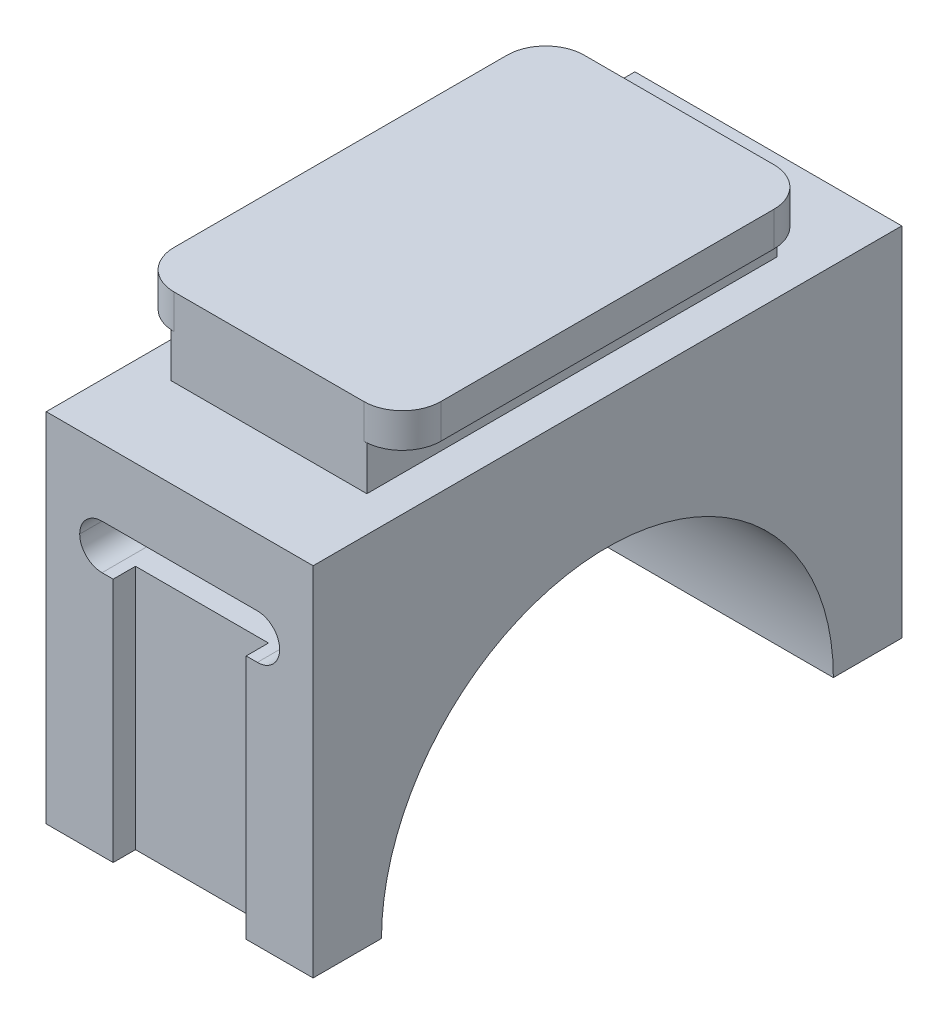
ISO-10303-21;
HEADER;
FILE_DESCRIPTION(('STEP AP214'),'2;1');
FILE_NAME('part.step','',(''),(''),'','','');
FILE_SCHEMA(('AUTOMOTIVE_DESIGN { 1 0 10303 214 1 1 1 1 }'));
ENDSEC;
DATA;
#1=APPLICATION_CONTEXT('core data for automotive mechanical design processes');
#2=APPLICATION_PROTOCOL_DEFINITION('international standard','automotive_design',2000,#1);
#3=PRODUCT_CONTEXT('',#1,'mechanical');
#4=PRODUCT('Part','Part','',(#3));
#5=PRODUCT_RELATED_PRODUCT_CATEGORY('part','',(#4));
#6=PRODUCT_DEFINITION_FORMATION('','',#4);
#7=PRODUCT_DEFINITION_CONTEXT('part definition',#1,'design');
#8=PRODUCT_DEFINITION('design','',#6,#7);
#9=PRODUCT_DEFINITION_SHAPE('','',#8);
#10=(LENGTH_UNIT() NAMED_UNIT(*) SI_UNIT(.MILLI.,.METRE.));
#11=(NAMED_UNIT(*) PLANE_ANGLE_UNIT() SI_UNIT($,.RADIAN.));
#12=(NAMED_UNIT(*) SI_UNIT($,.STERADIAN.) SOLID_ANGLE_UNIT());
#13=UNCERTAINTY_MEASURE_WITH_UNIT(LENGTH_MEASURE(1.E-05),#10,'distance_accuracy_value','');
#14=(GEOMETRIC_REPRESENTATION_CONTEXT(3) GLOBAL_UNCERTAINTY_ASSIGNED_CONTEXT((#13)) GLOBAL_UNIT_ASSIGNED_CONTEXT((#10,
#11,#12)) REPRESENTATION_CONTEXT('',''));
#15=CARTESIAN_POINT('',(0.,0.,0.));
#16=DIRECTION('',(0.,0.,1.));
#17=DIRECTION('',(1.,0.,0.));
#18=AXIS2_PLACEMENT_3D('',#15,#16,#17);
#19=CARTESIAN_POINT('',(0.,-22.8219,0.));
#20=DIRECTION('',(0.,-1.,0.));
#21=DIRECTION('',(0.,0.,-1.));
#22=AXIS2_PLACEMENT_3D('',#19,#20,#21);
#23=PLANE('',#22);
#24=DIRECTION('',(0.,0.,-1.));
#25=VECTOR('',#24,1.);
#26=CARTESIAN_POINT('',(11.3792,-22.8219,-3.81));
#27=LINE('',#26,#25);
#28=CARTESIAN_POINT('',(11.3792,-22.8219,-3.81));
#29=VERTEX_POINT('',#28);
#30=CARTESIAN_POINT('',(11.3792,-22.8219,-5.08));
#31=VERTEX_POINT('',#30);
#32=EDGE_CURVE('E310',#29,#31,#27,.T.);
#33=ORIENTED_EDGE('',*,*,#32,.T.);
#34=DIRECTION('',(1.,0.,0.));
#35=VECTOR('',#34,1.);
#36=CARTESIAN_POINT('',(15.1892,-22.8219,-5.08));
#37=LINE('',#36,#35);
#38=CARTESIAN_POINT('',(15.1892,-22.8219,-5.08));
#39=VERTEX_POINT('',#38);
#40=EDGE_CURVE('E368',#31,#39,#37,.T.);
#41=ORIENTED_EDGE('',*,*,#40,.T.);
#42=DIRECTION('',(0.,0.,1.));
#43=VECTOR('',#42,1.);
#44=CARTESIAN_POINT('',(15.1892,-22.8219,-5.08));
#45=LINE('',#44,#43);
#46=CARTESIAN_POINT('',(15.1892,-22.8219,-1.18745));
#47=VERTEX_POINT('',#46);
#48=EDGE_CURVE('E353',#39,#47,#45,.T.);
#49=ORIENTED_EDGE('',*,*,#48,.T.);
#50=DIRECTION('',(1.,0.,0.));
#51=VECTOR('',#50,1.);
#52=CARTESIAN_POINT('',(0.,-22.8219,-1.18745));
#53=LINE('',#52,#51);
#54=CARTESIAN_POINT('',(0.,-22.8219,-1.18745));
#55=VERTEX_POINT('',#54);
#56=EDGE_CURVE('E538',#55,#47,#53,.T.);
#57=ORIENTED_EDGE('',*,*,#56,.F.);
#58=DIRECTION('',(0.,0.,-1.));
#59=VECTOR('',#58,1.);
#60=CARTESIAN_POINT('',(0.,-22.8219,-5.08));
#61=LINE('',#60,#59);
#62=CARTESIAN_POINT('',(0.,-22.8219,-5.08));
#63=VERTEX_POINT('',#62);
#64=EDGE_CURVE('E363',#55,#63,#61,.T.);
#65=ORIENTED_EDGE('',*,*,#64,.T.);
#66=CARTESIAN_POINT('',(3.81,-22.8219,-5.08));
#67=VERTEX_POINT('',#66);
#68=EDGE_CURVE('E369',#63,#67,#37,.T.);
#69=ORIENTED_EDGE('',*,*,#68,.T.);
#70=DIRECTION('',(0.,0.,-1.));
#71=VECTOR('',#70,1.);
#72=CARTESIAN_POINT('',(3.81,-22.8219,-3.81));
#73=LINE('',#72,#71);
#74=CARTESIAN_POINT('',(3.81,-22.8219,-3.81));
#75=VERTEX_POINT('',#74);
#76=EDGE_CURVE('E323',#75,#67,#73,.T.);
#77=ORIENTED_EDGE('',*,*,#76,.F.);
#78=DIRECTION('',(-1.,0.,0.));
#79=VECTOR('',#78,1.);
#80=CARTESIAN_POINT('',(11.3792,-22.8219,-3.81));
#81=LINE('',#80,#79);
#82=EDGE_CURVE('E301',#29,#75,#81,.T.);
#83=ORIENTED_EDGE('',*,*,#82,.F.);
#84=EDGE_LOOP('',(#33,#41,#49,#57,#65,#69,#77,#83));
#85=FACE_BOUND('',#84,.T.);
#86=ADVANCED_FACE('F41',(#85),#23,.T.);
#87=CARTESIAN_POINT('',(2.1971,0.,21.1455));
#88=DIRECTION('',(0.,1.,0.));
#89=DIRECTION('',(0.,0.,1.));
#90=AXIS2_PLACEMENT_3D('',#87,#88,#89);
#91=PLANE('',#90);
#92=DIRECTION('',(0.,0.,1.));
#93=VECTOR('',#92,1.);
#94=CARTESIAN_POINT('',(13.1699,0.,0.));
#95=LINE('',#94,#93);
#96=CARTESIAN_POINT('',(13.1699,0.,0.00720603681365504));
#97=VERTEX_POINT('',#96);
#98=CARTESIAN_POINT('',(13.1699,0.,23.3353939631863));
#99=VERTEX_POINT('',#98);
#100=EDGE_CURVE('E425',#97,#99,#95,.T.);
#101=ORIENTED_EDGE('',*,*,#100,.F.);
#102=CARTESIAN_POINT('',(12.9921,0.,2.1971));
#103=DIRECTION('',(0.,1.,0.));
#104=DIRECTION('',(0.,0.,-1.));
#105=AXIS2_PLACEMENT_3D('',#102,#103,#104);
#106=CIRCLE('',#105,2.1971);
#107=CARTESIAN_POINT('',(15.1892,0.,2.19710000000002));
#108=VERTEX_POINT('',#107);
#109=EDGE_CURVE('E496',#108,#97,#106,.T.);
#110=ORIENTED_EDGE('',*,*,#109,.F.);
#111=DIRECTION('',(0.,0.,-1.));
#112=VECTOR('',#111,1.);
#113=CARTESIAN_POINT('',(15.1892,0.,2.19710000000001));
#114=LINE('',#113,#112);
#115=CARTESIAN_POINT('',(15.1892,0.,21.1455));
#116=VERTEX_POINT('',#115);
#117=EDGE_CURVE('E492',#116,#108,#114,.T.);
#118=ORIENTED_EDGE('',*,*,#117,.F.);
#119=CARTESIAN_POINT('',(12.9921,0.,21.1455));
#120=DIRECTION('',(0.,1.,0.));
#121=DIRECTION('',(0.,0.,1.));
#122=AXIS2_PLACEMENT_3D('',#119,#120,#121);
#123=CIRCLE('',#122,2.1971);
#124=EDGE_CURVE('E487',#99,#116,#123,.T.);
#125=ORIENTED_EDGE('',*,*,#124,.F.);
#126=EDGE_LOOP('',(#101,#110,#118,#125));
#127=FACE_BOUND('',#126,.T.);
#128=ADVANCED_FACE('F660',(#127),#91,.F.);
#129=DIRECTION('',(0.,0.,-1.));
#130=VECTOR('',#129,1.);
#131=CARTESIAN_POINT('',(2.0193,0.,0.));
#132=LINE('',#131,#130);
#133=CARTESIAN_POINT('',(2.0193,0.,23.3353939631863));
#134=VERTEX_POINT('',#133);
#135=CARTESIAN_POINT('',(2.0193,0.,0.00720603681365417));
#136=VERTEX_POINT('',#135);
#137=EDGE_CURVE('E436',#134,#136,#132,.T.);
#138=ORIENTED_EDGE('',*,*,#137,.F.);
#139=CARTESIAN_POINT('',(2.1971,0.,21.1455));
#140=DIRECTION('',(0.,1.,0.));
#141=DIRECTION('',(0.,0.,1.));
#142=AXIS2_PLACEMENT_3D('',#139,#140,#141);
#143=CIRCLE('',#142,2.1971);
#144=CARTESIAN_POINT('',(0.,0.,21.1455));
#145=VERTEX_POINT('',#144);
#146=EDGE_CURVE('E483',#145,#134,#143,.T.);
#147=ORIENTED_EDGE('',*,*,#146,.F.);
#148=DIRECTION('',(0.,0.,1.));
#149=VECTOR('',#148,1.);
#150=CARTESIAN_POINT('',(0.,0.,2.19710000000002));
#151=LINE('',#150,#149);
#152=CARTESIAN_POINT('',(0.,0.,2.19710000000002));
#153=VERTEX_POINT('',#152);
#154=EDGE_CURVE('E461',#153,#145,#151,.T.);
#155=ORIENTED_EDGE('',*,*,#154,.F.);
#156=CARTESIAN_POINT('',(2.1971,0.,2.1971));
#157=DIRECTION('',(0.,1.,0.));
#158=DIRECTION('',(0.,0.,1.));
#159=AXIS2_PLACEMENT_3D('',#156,#157,#158);
#160=CIRCLE('',#159,2.1971);
#161=EDGE_CURVE('E500',#136,#153,#160,.T.);
#162=ORIENTED_EDGE('',*,*,#161,.F.);
#163=EDGE_LOOP('',(#138,#147,#155,#162));
#164=FACE_BOUND('',#163,.T.);
#165=ADVANCED_FACE('F665',(#164),#91,.F.);
#166=CARTESIAN_POINT('',(2.1971,1.9558,21.1455));
#167=DIRECTION('',(0.,-1.,0.));
#168=DIRECTION('',(0.,0.,-1.));
#169=AXIS2_PLACEMENT_3D('',#166,#167,#168);
#170=CYLINDRICAL_SURFACE('',#169,2.1971);
#171=ORIENTED_EDGE('',*,*,#146,.T.);
#172=CARTESIAN_POINT('',(2.19710000000002,0.,23.3426));
#173=VERTEX_POINT('',#172);
#174=EDGE_CURVE('E455',#134,#173,#143,.T.);
#175=ORIENTED_EDGE('',*,*,#174,.T.);
#176=DIRECTION('',(0.,-1.,0.));
#177=VECTOR('',#176,1.);
#178=CARTESIAN_POINT('',(2.19710000000002,1.9558,23.3426));
#179=LINE('',#178,#177);
#180=CARTESIAN_POINT('',(2.19710000000002,1.9558,23.3426));
#181=VERTEX_POINT('',#180);
#182=EDGE_CURVE('E531',#181,#173,#179,.T.);
#183=ORIENTED_EDGE('',*,*,#182,.F.);
#184=CARTESIAN_POINT('',(2.1971,1.9558,21.1455));
#185=DIRECTION('',(0.,1.,0.));
#186=DIRECTION('',(0.,0.,1.));
#187=AXIS2_PLACEMENT_3D('',#184,#185,#186);
#188=CIRCLE('',#187,2.1971);
#189=CARTESIAN_POINT('',(0.,1.9558,21.1455));
#190=VERTEX_POINT('',#189);
#191=EDGE_CURVE('E456',#190,#181,#188,.T.);
#192=ORIENTED_EDGE('',*,*,#191,.F.);
#193=DIRECTION('',(0.,-1.,0.));
#194=VECTOR('',#193,1.);
#195=CARTESIAN_POINT('',(0.,1.9558,21.1455));
#196=LINE('',#195,#194);
#197=EDGE_CURVE('E482',#190,#145,#196,.T.);
#198=ORIENTED_EDGE('',*,*,#197,.T.);
#199=EDGE_LOOP('',(#171,#175,#183,#192,#198));
#200=FACE_BOUND('',#199,.T.);
#201=ADVANCED_FACE('F720',(#200),#170,.T.);
#202=CARTESIAN_POINT('',(2.19710000000002,1.9558,23.3426));
#203=DIRECTION('',(0.,0.,-1.));
#204=DIRECTION('',(-1.,0.,0.));
#205=AXIS2_PLACEMENT_3D('',#202,#203,#204);
#206=PLANE('',#205);
#207=ORIENTED_EDGE('',*,*,#182,.T.);
#208=DIRECTION('',(-1.,0.,0.));
#209=VECTOR('',#208,1.);
#210=CARTESIAN_POINT('',(13.1699,0.,23.3426));
#211=LINE('',#210,#209);
#212=CARTESIAN_POINT('',(2.0193,0.,23.3426));
#213=VERTEX_POINT('',#212);
#214=EDGE_CURVE('E424',#173,#213,#211,.T.);
#215=ORIENTED_EDGE('',*,*,#214,.T.);
#216=DIRECTION('',(0.,1.,0.));
#217=VECTOR('',#216,1.);
#218=CARTESIAN_POINT('',(2.0193,-2.5019,23.3426));
#219=LINE('',#218,#217);
#220=CARTESIAN_POINT('',(2.0193,-2.5019,23.3426));
#221=VERTEX_POINT('',#220);
#222=EDGE_CURVE('E447',#221,#213,#219,.T.);
#223=ORIENTED_EDGE('',*,*,#222,.F.);
#224=DIRECTION('',(-1.,0.,0.));
#225=VECTOR('',#224,1.);
#226=CARTESIAN_POINT('',(13.1699,-2.5019,23.3426));
#227=LINE('',#226,#225);
#228=CARTESIAN_POINT('',(13.1699,-2.5019,23.3426));
#229=VERTEX_POINT('',#228);
#230=EDGE_CURVE('E406',#229,#221,#227,.T.);
#231=ORIENTED_EDGE('',*,*,#230,.F.);
#232=DIRECTION('',(0.,1.,0.));
#233=VECTOR('',#232,1.);
#234=CARTESIAN_POINT('',(13.1699,-2.5019,23.3426));
#235=LINE('',#234,#233);
#236=CARTESIAN_POINT('',(13.1699,0.,23.3426));
#237=VERTEX_POINT('',#236);
#238=EDGE_CURVE('E451',#229,#237,#235,.T.);
#239=ORIENTED_EDGE('',*,*,#238,.T.);
#240=CARTESIAN_POINT('',(12.9921,0.,23.3426));
#241=VERTEX_POINT('',#240);
#242=EDGE_CURVE('E426',#237,#241,#211,.T.);
#243=ORIENTED_EDGE('',*,*,#242,.T.);
#244=DIRECTION('',(0.,-1.,0.));
#245=VECTOR('',#244,1.);
#246=CARTESIAN_POINT('',(12.9921,1.9558,23.3426));
#247=LINE('',#246,#245);
#248=CARTESIAN_POINT('',(12.9921,1.9558,23.3426));
#249=VERTEX_POINT('',#248);
#250=EDGE_CURVE('E528',#249,#241,#247,.T.);
#251=ORIENTED_EDGE('',*,*,#250,.F.);
#252=DIRECTION('',(1.,0.,0.));
#253=VECTOR('',#252,1.);
#254=CARTESIAN_POINT('',(2.19710000000002,1.9558,23.3426));
#255=LINE('',#254,#253);
#256=EDGE_CURVE('E460',#181,#249,#255,.T.);
#257=ORIENTED_EDGE('',*,*,#256,.F.);
#258=EDGE_LOOP('',(#207,#215,#223,#231,#239,#243,#251,#257));
#259=FACE_BOUND('',#258,.T.);
#260=ADVANCED_FACE('F723',(#259),#206,.F.);
#261=CARTESIAN_POINT('',(12.9921,1.9558,21.1455));
#262=DIRECTION('',(0.,-1.,0.));
#263=DIRECTION('',(0.,0.,-1.));
#264=AXIS2_PLACEMENT_3D('',#261,#262,#263);
#265=CYLINDRICAL_SURFACE('',#264,2.1971);
#266=EDGE_CURVE('E488',#241,#99,#123,.T.);
#267=ORIENTED_EDGE('',*,*,#266,.T.);
#268=ORIENTED_EDGE('',*,*,#124,.T.);
#269=DIRECTION('',(0.,-1.,0.));
#270=VECTOR('',#269,1.);
#271=CARTESIAN_POINT('',(15.1892,1.9558,21.1455));
#272=LINE('',#271,#270);
#273=CARTESIAN_POINT('',(15.1892,1.9558,21.1455));
#274=VERTEX_POINT('',#273);
#275=EDGE_CURVE('E524',#274,#116,#272,.T.);
#276=ORIENTED_EDGE('',*,*,#275,.F.);
#277=CARTESIAN_POINT('',(12.9921,1.9558,21.1455));
#278=DIRECTION('',(0.,1.,0.));
#279=DIRECTION('',(0.,0.,1.));
#280=AXIS2_PLACEMENT_3D('',#277,#278,#279);
#281=CIRCLE('',#280,2.1971);
#282=EDGE_CURVE('E464',#249,#274,#281,.T.);
#283=ORIENTED_EDGE('',*,*,#282,.F.);
#284=ORIENTED_EDGE('',*,*,#250,.T.);
#285=EDGE_LOOP('',(#267,#268,#276,#283,#284));
#286=FACE_BOUND('',#285,.T.);
#287=ADVANCED_FACE('F727',(#286),#265,.T.);
#288=CARTESIAN_POINT('',(15.1892,1.9558,2.19710000000001));
#289=DIRECTION('',(-1.,0.,0.));
#290=DIRECTION('',(0.,0.,1.));
#291=AXIS2_PLACEMENT_3D('',#288,#289,#290);
#292=PLANE('',#291);
#293=ORIENTED_EDGE('',*,*,#117,.T.);
#294=DIRECTION('',(0.,-1.,0.));
#295=VECTOR('',#294,1.);
#296=CARTESIAN_POINT('',(15.1892,1.9558,2.19710000000002));
#297=LINE('',#296,#295);
#298=CARTESIAN_POINT('',(15.1892,1.9558,2.19710000000002));
#299=VERTEX_POINT('',#298);
#300=EDGE_CURVE('E520',#299,#108,#297,.T.);
#301=ORIENTED_EDGE('',*,*,#300,.F.);
#302=DIRECTION('',(0.,0.,-1.));
#303=VECTOR('',#302,1.);
#304=CARTESIAN_POINT('',(15.1892,1.9558,2.19710000000001));
#305=LINE('',#304,#303);
#306=EDGE_CURVE('E467',#274,#299,#305,.T.);
#307=ORIENTED_EDGE('',*,*,#306,.F.);
#308=ORIENTED_EDGE('',*,*,#275,.T.);
#309=EDGE_LOOP('',(#293,#301,#307,#308));
#310=FACE_BOUND('',#309,.T.);
#311=ADVANCED_FACE('F731',(#310),#292,.F.);
#312=CARTESIAN_POINT('',(12.9921,1.9558,2.1971));
#313=DIRECTION('',(0.,-1.,0.));
#314=DIRECTION('',(0.,0.,-1.));
#315=AXIS2_PLACEMENT_3D('',#312,#313,#314);
#316=CYLINDRICAL_SURFACE('',#315,2.1971);
#317=ORIENTED_EDGE('',*,*,#109,.T.);
#318=CARTESIAN_POINT('',(12.9921,0.,0.));
#319=VERTEX_POINT('',#318);
#320=EDGE_CURVE('E495',#97,#319,#106,.T.);
#321=ORIENTED_EDGE('',*,*,#320,.T.);
#322=DIRECTION('',(0.,-1.,0.));
#323=VECTOR('',#322,1.);
#324=CARTESIAN_POINT('',(12.9921,1.9558,0.));
#325=LINE('',#324,#323);
#326=CARTESIAN_POINT('',(12.9921,1.9558,0.));
#327=VERTEX_POINT('',#326);
#328=EDGE_CURVE('E516',#327,#319,#325,.T.);
#329=ORIENTED_EDGE('',*,*,#328,.F.);
#330=CARTESIAN_POINT('',(12.9921,1.9558,2.1971));
#331=DIRECTION('',(0.,1.,0.));
#332=DIRECTION('',(0.,0.,-1.));
#333=AXIS2_PLACEMENT_3D('',#330,#331,#332);
#334=CIRCLE('',#333,2.1971);
#335=EDGE_CURVE('E470',#299,#327,#334,.T.);
#336=ORIENTED_EDGE('',*,*,#335,.F.);
#337=ORIENTED_EDGE('',*,*,#300,.T.);
#338=EDGE_LOOP('',(#317,#321,#329,#336,#337));
#339=FACE_BOUND('',#338,.T.);
#340=ADVANCED_FACE('F735',(#339),#316,.T.);
#341=CARTESIAN_POINT('',(2.19710000000002,1.9558,0.));
#342=DIRECTION('',(0.,0.,1.));
#343=DIRECTION('',(1.,0.,0.));
#344=AXIS2_PLACEMENT_3D('',#341,#342,#343);
#345=PLANE('',#344);
#346=ORIENTED_EDGE('',*,*,#328,.T.);
#347=DIRECTION('',(1.,0.,0.));
#348=VECTOR('',#347,1.);
#349=CARTESIAN_POINT('',(13.1699,0.,0.));
#350=LINE('',#349,#348);
#351=CARTESIAN_POINT('',(13.1699,0.,0.));
#352=VERTEX_POINT('',#351);
#353=EDGE_CURVE('E435',#319,#352,#350,.T.);
#354=ORIENTED_EDGE('',*,*,#353,.T.);
#355=DIRECTION('',(0.,1.,0.));
#356=VECTOR('',#355,1.);
#357=CARTESIAN_POINT('',(13.1699,-2.5019,0.));
#358=LINE('',#357,#356);
#359=CARTESIAN_POINT('',(13.1699,-2.5019,0.));
#360=VERTEX_POINT('',#359);
#361=EDGE_CURVE('E419',#360,#352,#358,.T.);
#362=ORIENTED_EDGE('',*,*,#361,.F.);
#363=DIRECTION('',(1.,0.,0.));
#364=VECTOR('',#363,1.);
#365=CARTESIAN_POINT('',(13.1699,-2.5019,0.));
#366=LINE('',#365,#364);
#367=CARTESIAN_POINT('',(2.0193,-2.5019,0.));
#368=VERTEX_POINT('',#367);
#369=EDGE_CURVE('E415',#368,#360,#366,.T.);
#370=ORIENTED_EDGE('',*,*,#369,.F.);
#371=DIRECTION('',(0.,1.,0.));
#372=VECTOR('',#371,1.);
#373=CARTESIAN_POINT('',(2.0193,-2.5019,0.));
#374=LINE('',#373,#372);
#375=CARTESIAN_POINT('',(2.0193,0.,0.));
#376=VERTEX_POINT('',#375);
#377=EDGE_CURVE('E443',#368,#376,#374,.T.);
#378=ORIENTED_EDGE('',*,*,#377,.T.);
#379=CARTESIAN_POINT('',(2.19710000000002,0.,0.));
#380=VERTEX_POINT('',#379);
#381=EDGE_CURVE('E407',#376,#380,#350,.T.);
#382=ORIENTED_EDGE('',*,*,#381,.T.);
#383=DIRECTION('',(0.,-1.,0.));
#384=VECTOR('',#383,1.);
#385=CARTESIAN_POINT('',(2.19710000000002,1.9558,0.));
#386=LINE('',#385,#384);
#387=CARTESIAN_POINT('',(2.19710000000002,1.9558,0.));
#388=VERTEX_POINT('',#387);
#389=EDGE_CURVE('E513',#388,#380,#386,.T.);
#390=ORIENTED_EDGE('',*,*,#389,.F.);
#391=DIRECTION('',(-1.,0.,0.));
#392=VECTOR('',#391,1.);
#393=CARTESIAN_POINT('',(2.19710000000002,1.9558,0.));
#394=LINE('',#393,#392);
#395=EDGE_CURVE('E473',#327,#388,#394,.T.);
#396=ORIENTED_EDGE('',*,*,#395,.F.);
#397=EDGE_LOOP('',(#346,#354,#362,#370,#378,#382,#390,#396));
#398=FACE_BOUND('',#397,.T.);
#399=ADVANCED_FACE('F739',(#398),#345,.F.);
#400=CARTESIAN_POINT('',(2.1971,1.9558,2.1971));
#401=DIRECTION('',(0.,-1.,0.));
#402=DIRECTION('',(0.,0.,-1.));
#403=AXIS2_PLACEMENT_3D('',#400,#401,#402);
#404=CYLINDRICAL_SURFACE('',#403,2.1971);
#405=EDGE_CURVE('E501',#380,#136,#160,.T.);
#406=ORIENTED_EDGE('',*,*,#405,.T.);
#407=ORIENTED_EDGE('',*,*,#161,.T.);
#408=DIRECTION('',(0.,-1.,0.));
#409=VECTOR('',#408,1.);
#410=CARTESIAN_POINT('',(0.,1.9558,2.19710000000002));
#411=LINE('',#410,#409);
#412=CARTESIAN_POINT('',(0.,1.9558,2.19710000000002));
#413=VERTEX_POINT('',#412);
#414=EDGE_CURVE('E509',#413,#153,#411,.T.);
#415=ORIENTED_EDGE('',*,*,#414,.F.);
#416=CARTESIAN_POINT('',(2.1971,1.9558,2.1971));
#417=DIRECTION('',(0.,1.,0.));
#418=DIRECTION('',(0.,0.,1.));
#419=AXIS2_PLACEMENT_3D('',#416,#417,#418);
#420=CIRCLE('',#419,2.1971);
#421=EDGE_CURVE('E476',#388,#413,#420,.T.);
#422=ORIENTED_EDGE('',*,*,#421,.F.);
#423=ORIENTED_EDGE('',*,*,#389,.T.);
#424=EDGE_LOOP('',(#406,#407,#415,#422,#423));
#425=FACE_BOUND('',#424,.T.);
#426=ADVANCED_FACE('F743',(#425),#404,.T.);
#427=CARTESIAN_POINT('',(0.,1.9558,2.19710000000002));
#428=DIRECTION('',(1.,0.,0.));
#429=DIRECTION('',(0.,0.,-1.));
#430=AXIS2_PLACEMENT_3D('',#427,#428,#429);
#431=PLANE('',#430);
#432=ORIENTED_EDGE('',*,*,#154,.T.);
#433=ORIENTED_EDGE('',*,*,#197,.F.);
#434=DIRECTION('',(0.,0.,1.));
#435=VECTOR('',#434,1.);
#436=CARTESIAN_POINT('',(0.,1.9558,2.19710000000002));
#437=LINE('',#436,#435);
#438=EDGE_CURVE('E479',#413,#190,#437,.T.);
#439=ORIENTED_EDGE('',*,*,#438,.F.);
#440=ORIENTED_EDGE('',*,*,#414,.T.);
#441=EDGE_LOOP('',(#432,#433,#439,#440));
#442=FACE_BOUND('',#441,.T.);
#443=ADVANCED_FACE('F747',(#442),#431,.F.);
#444=CARTESIAN_POINT('',(2.1971,1.9558,21.1455));
#445=DIRECTION('',(0.,1.,0.));
#446=DIRECTION('',(0.,0.,1.));
#447=AXIS2_PLACEMENT_3D('',#444,#445,#446);
#448=PLANE('',#447);
#449=ORIENTED_EDGE('',*,*,#191,.T.);
#450=ORIENTED_EDGE('',*,*,#256,.T.);
#451=ORIENTED_EDGE('',*,*,#282,.T.);
#452=ORIENTED_EDGE('',*,*,#306,.T.);
#453=ORIENTED_EDGE('',*,*,#335,.T.);
#454=ORIENTED_EDGE('',*,*,#395,.T.);
#455=ORIENTED_EDGE('',*,*,#421,.T.);
#456=ORIENTED_EDGE('',*,*,#438,.T.);
#457=EDGE_LOOP('',(#449,#450,#451,#452,#453,#454,#455,#456));
#458=FACE_BOUND('',#457,.T.);
#459=ADVANCED_FACE('F750',(#458),#448,.T.);
#460=CARTESIAN_POINT('',(0.,0.,0.));
#461=DIRECTION('',(0.,-1.,0.));
#462=DIRECTION('',(0.,0.,-1.));
#463=AXIS2_PLACEMENT_3D('',#460,#461,#462);
#464=PLANE('',#463);
#465=ORIENTED_EDGE('',*,*,#174,.F.);
#466=EDGE_CURVE('E431',#213,#134,#132,.T.);
#467=ORIENTED_EDGE('',*,*,#466,.F.);
#468=ORIENTED_EDGE('',*,*,#214,.F.);
#469=EDGE_LOOP('',(#465,#467,#468));
#470=FACE_BOUND('',#469,.T.);
#471=ADVANCED_FACE('F755',(#470),#464,.F.);
#472=ORIENTED_EDGE('',*,*,#405,.F.);
#473=ORIENTED_EDGE('',*,*,#381,.F.);
#474=EDGE_CURVE('E430',#136,#376,#132,.T.);
#475=ORIENTED_EDGE('',*,*,#474,.F.);
#476=EDGE_LOOP('',(#472,#473,#475));
#477=FACE_BOUND('',#476,.T.);
#478=ADVANCED_FACE('F909',(#477),#464,.F.);
#479=ORIENTED_EDGE('',*,*,#320,.F.);
#480=EDGE_CURVE('E420',#352,#97,#95,.T.);
#481=ORIENTED_EDGE('',*,*,#480,.F.);
#482=ORIENTED_EDGE('',*,*,#353,.F.);
#483=EDGE_LOOP('',(#479,#481,#482));
#484=FACE_BOUND('',#483,.T.);
#485=ADVANCED_FACE('F761',(#484),#464,.F.);
#486=CARTESIAN_POINT('',(13.1699,-2.5019,0.));
#487=DIRECTION('',(-1.,0.,0.));
#488=DIRECTION('',(0.,0.,1.));
#489=AXIS2_PLACEMENT_3D('',#486,#487,#488);
#490=PLANE('',#489);
#491=ORIENTED_EDGE('',*,*,#480,.T.);
#492=ORIENTED_EDGE('',*,*,#100,.T.);
#493=EDGE_CURVE('E401',#99,#237,#95,.T.);
#494=ORIENTED_EDGE('',*,*,#493,.T.);
#495=ORIENTED_EDGE('',*,*,#238,.F.);
#496=DIRECTION('',(0.,0.,1.));
#497=VECTOR('',#496,1.);
#498=CARTESIAN_POINT('',(13.1699,-2.5019,0.));
#499=LINE('',#498,#497);
#500=EDGE_CURVE('E402',#360,#229,#499,.T.);
#501=ORIENTED_EDGE('',*,*,#500,.F.);
#502=ORIENTED_EDGE('',*,*,#361,.T.);
#503=EDGE_LOOP('',(#491,#492,#494,#495,#501,#502));
#504=FACE_BOUND('',#503,.T.);
#505=ADVANCED_FACE('F757',(#504),#490,.F.);
#506=CARTESIAN_POINT('',(2.0193,-2.5019,0.));
#507=DIRECTION('',(1.,0.,0.));
#508=DIRECTION('',(0.,0.,-1.));
#509=AXIS2_PLACEMENT_3D('',#506,#507,#508);
#510=PLANE('',#509);
#511=ORIENTED_EDGE('',*,*,#466,.T.);
#512=ORIENTED_EDGE('',*,*,#137,.T.);
#513=ORIENTED_EDGE('',*,*,#474,.T.);
#514=ORIENTED_EDGE('',*,*,#377,.F.);
#515=DIRECTION('',(0.,0.,-1.));
#516=VECTOR('',#515,1.);
#517=CARTESIAN_POINT('',(2.0193,-2.5019,0.));
#518=LINE('',#517,#516);
#519=EDGE_CURVE('E411',#221,#368,#518,.T.);
#520=ORIENTED_EDGE('',*,*,#519,.F.);
#521=ORIENTED_EDGE('',*,*,#222,.T.);
#522=EDGE_LOOP('',(#511,#512,#513,#514,#520,#521));
#523=FACE_BOUND('',#522,.T.);
#524=ADVANCED_FACE('F760',(#523),#510,.F.);
#525=ORIENTED_EDGE('',*,*,#266,.F.);
#526=ORIENTED_EDGE('',*,*,#242,.F.);
#527=ORIENTED_EDGE('',*,*,#493,.F.);
#528=EDGE_LOOP('',(#525,#526,#527));
#529=FACE_BOUND('',#528,.T.);
#530=ADVANCED_FACE('F765',(#529),#464,.F.);
#531=CARTESIAN_POINT('',(0.,-2.5019,0.));
#532=DIRECTION('',(0.,-1.,0.));
#533=DIRECTION('',(0.,0.,-1.));
#534=AXIS2_PLACEMENT_3D('',#531,#532,#533);
#535=PLANE('',#534);
#536=DIRECTION('',(0.,0.,1.));
#537=VECTOR('',#536,1.);
#538=CARTESIAN_POINT('',(15.1892,-2.5019,-5.08));
#539=LINE('',#538,#537);
#540=CARTESIAN_POINT('',(15.1892,-2.5019,-5.08));
#541=VERTEX_POINT('',#540);
#542=CARTESIAN_POINT('',(15.1892,-2.5019,28.4226));
#543=VERTEX_POINT('',#542);
#544=EDGE_CURVE('E350',#541,#543,#539,.T.);
#545=ORIENTED_EDGE('',*,*,#544,.F.);
#546=DIRECTION('',(1.,0.,0.));
#547=VECTOR('',#546,1.);
#548=CARTESIAN_POINT('',(15.1892,-2.5019,-5.08));
#549=LINE('',#548,#547);
#550=CARTESIAN_POINT('',(0.,-2.5019,-5.08));
#551=VERTEX_POINT('',#550);
#552=EDGE_CURVE('E383',#551,#541,#549,.T.);
#553=ORIENTED_EDGE('',*,*,#552,.F.);
#554=DIRECTION('',(0.,0.,-1.));
#555=VECTOR('',#554,1.);
#556=CARTESIAN_POINT('',(0.,-2.5019,-5.08));
#557=LINE('',#556,#555);
#558=CARTESIAN_POINT('',(0.,-2.5019,28.4226));
#559=VERTEX_POINT('',#558);
#560=EDGE_CURVE('E380',#559,#551,#557,.T.);
#561=ORIENTED_EDGE('',*,*,#560,.F.);
#562=DIRECTION('',(-1.,0.,0.));
#563=VECTOR('',#562,1.);
#564=CARTESIAN_POINT('',(15.1892,-2.5019,28.4226));
#565=LINE('',#564,#563);
#566=EDGE_CURVE('E377',#543,#559,#565,.T.);
#567=ORIENTED_EDGE('',*,*,#566,.F.);
#568=EDGE_LOOP('',(#545,#553,#561,#567));
#569=FACE_BOUND('',#568,.T.);
#570=ORIENTED_EDGE('',*,*,#369,.T.);
#571=ORIENTED_EDGE('',*,*,#500,.T.);
#572=ORIENTED_EDGE('',*,*,#230,.T.);
#573=ORIENTED_EDGE('',*,*,#519,.T.);
#574=EDGE_LOOP('',(#570,#571,#572,#573));
#575=FACE_BOUND('',#574,.T.);
#576=ADVANCED_FACE('F618',(#569,#575),#535,.F.);
#577=CARTESIAN_POINT('',(15.1892,-22.8219,-5.08));
#578=DIRECTION('',(-1.,0.,0.));
#579=DIRECTION('',(0.,0.,1.));
#580=AXIS2_PLACEMENT_3D('',#577,#578,#579);
#581=PLANE('',#580);
#582=CARTESIAN_POINT('',(15.1892,-22.8219,24.53005));
#583=VERTEX_POINT('',#582);
#584=CARTESIAN_POINT('',(15.1892,-22.8219,28.4226));
#585=VERTEX_POINT('',#584);
#586=EDGE_CURVE('E358',#583,#585,#45,.T.);
#587=ORIENTED_EDGE('',*,*,#586,.F.);
#588=CARTESIAN_POINT('',(15.1892,-22.8219,11.6713));
#589=DIRECTION('',(1.,0.,0.));
#590=DIRECTION('',(0.,0.,-1.));
#591=AXIS2_PLACEMENT_3D('',#588,#589,#590);
#592=CIRCLE('',#591,12.85875);
#593=EDGE_CURVE('E338',#47,#583,#592,.T.);
#594=ORIENTED_EDGE('',*,*,#593,.F.);
#595=ORIENTED_EDGE('',*,*,#48,.F.);
#596=DIRECTION('',(0.,1.,0.));
#597=VECTOR('',#596,1.);
#598=CARTESIAN_POINT('',(15.1892,-22.8219,-5.08));
#599=LINE('',#598,#597);
#600=EDGE_CURVE('E373',#39,#541,#599,.T.);
#601=ORIENTED_EDGE('',*,*,#600,.T.);
#602=ORIENTED_EDGE('',*,*,#544,.T.);
#603=DIRECTION('',(0.,1.,0.));
#604=VECTOR('',#603,1.);
#605=CARTESIAN_POINT('',(15.1892,-22.8219,28.4226));
#606=LINE('',#605,#604);
#607=EDGE_CURVE('E397',#585,#543,#606,.T.);
#608=ORIENTED_EDGE('',*,*,#607,.F.);
#609=EDGE_LOOP('',(#587,#594,#595,#601,#602,#608));
#610=FACE_BOUND('',#609,.T.);
#611=ADVANCED_FACE('F623',(#610),#581,.F.);
#612=CARTESIAN_POINT('',(15.1892,-22.8219,28.4226));
#613=DIRECTION('',(0.,0.,-1.));
#614=DIRECTION('',(-1.,0.,0.));
#615=AXIS2_PLACEMENT_3D('',#612,#613,#614);
#616=PLANE('',#615);
#617=DIRECTION('',(1.,0.,0.));
#618=VECTOR('',#617,1.);
#619=CARTESIAN_POINT('',(1.905,-8.8519,28.4226));
#620=LINE('',#619,#618);
#621=CARTESIAN_POINT('',(11.3792,-8.8519,28.4226));
#622=VERTEX_POINT('',#621);
#623=CARTESIAN_POINT('',(12.0142,-8.8519,28.4226));
#624=VERTEX_POINT('',#623);
#625=EDGE_CURVE('E342',#622,#624,#620,.T.);
#626=ORIENTED_EDGE('',*,*,#625,.F.);
#627=DIRECTION('',(0.,1.,0.));
#628=VECTOR('',#627,1.);
#629=CARTESIAN_POINT('',(11.3792,-22.8219,28.4226));
#630=LINE('',#629,#628);
#631=CARTESIAN_POINT('',(11.3792,-22.8219,28.4226));
#632=VERTEX_POINT('',#631);
#633=EDGE_CURVE('E683',#632,#622,#630,.T.);
#634=ORIENTED_EDGE('',*,*,#633,.F.);
#635=DIRECTION('',(-1.,0.,0.));
#636=VECTOR('',#635,1.);
#637=CARTESIAN_POINT('',(15.1892,-22.8219,28.4226));
#638=LINE('',#637,#636);
#639=EDGE_CURVE('E359',#585,#632,#638,.T.);
#640=ORIENTED_EDGE('',*,*,#639,.F.);
#641=ORIENTED_EDGE('',*,*,#607,.T.);
#642=ORIENTED_EDGE('',*,*,#566,.T.);
#643=DIRECTION('',(0.,1.,0.));
#644=VECTOR('',#643,1.);
#645=CARTESIAN_POINT('',(0.,-22.8219,28.4226));
#646=LINE('',#645,#644);
#647=CARTESIAN_POINT('',(0.,-22.8219,28.4226));
#648=VERTEX_POINT('',#647);
#649=EDGE_CURVE('E393',#648,#559,#646,.T.);
#650=ORIENTED_EDGE('',*,*,#649,.F.);
#651=CARTESIAN_POINT('',(3.81,-22.8219,28.4226));
#652=VERTEX_POINT('',#651);
#653=EDGE_CURVE('E357',#652,#648,#638,.T.);
#654=ORIENTED_EDGE('',*,*,#653,.F.);
#655=DIRECTION('',(0.,-1.,0.));
#656=VECTOR('',#655,1.);
#657=CARTESIAN_POINT('',(3.81,-22.8219,28.4226));
#658=LINE('',#657,#656);
#659=CARTESIAN_POINT('',(3.81,-8.8519,28.4226));
#660=VERTEX_POINT('',#659);
#661=EDGE_CURVE('E680',#660,#652,#658,.T.);
#662=ORIENTED_EDGE('',*,*,#661,.F.);
#663=CARTESIAN_POINT('',(3.175,-8.8519,28.4226));
#664=VERTEX_POINT('',#663);
#665=EDGE_CURVE('E286',#664,#660,#620,.T.);
#666=ORIENTED_EDGE('',*,*,#665,.F.);
#667=CARTESIAN_POINT('',(3.175,-7.5819,28.4226));
#668=DIRECTION('',(0.,0.,-1.));
#669=DIRECTION('',(-1.,0.,0.));
#670=AXIS2_PLACEMENT_3D('',#667,#668,#669);
#671=CIRCLE('',#670,1.27);
#672=CARTESIAN_POINT('',(1.905,-7.5819,28.4226));
#673=VERTEX_POINT('',#672);
#674=EDGE_CURVE('E51',#664,#673,#671,.T.);
#675=ORIENTED_EDGE('',*,*,#674,.T.);
#676=CARTESIAN_POINT('',(3.175,-7.5819,28.4226));
#677=DIRECTION('',(0.,0.,-1.));
#678=DIRECTION('',(-1.,0.,0.));
#679=AXIS2_PLACEMENT_3D('',#676,#677,#678);
#680=CIRCLE('',#679,1.27);
#681=CARTESIAN_POINT('',(3.175,-6.3119,28.4226));
#682=VERTEX_POINT('',#681);
#683=EDGE_CURVE('E568',#673,#682,#680,.T.);
#684=ORIENTED_EDGE('',*,*,#683,.T.);
#685=DIRECTION('',(-1.,0.,0.));
#686=VECTOR('',#685,1.);
#687=CARTESIAN_POINT('',(1.905,-6.3119,28.4226));
#688=LINE('',#687,#686);
#689=CARTESIAN_POINT('',(12.0142,-6.3119,28.4226));
#690=VERTEX_POINT('',#689);
#691=EDGE_CURVE('E341',#690,#682,#688,.T.);
#692=ORIENTED_EDGE('',*,*,#691,.F.);
#693=CARTESIAN_POINT('',(12.0142,-7.5819,28.4226));
#694=DIRECTION('',(0.,0.,-1.));
#695=DIRECTION('',(-1.,0.,0.));
#696=AXIS2_PLACEMENT_3D('',#693,#694,#695);
#697=CIRCLE('',#696,1.27);
#698=CARTESIAN_POINT('',(13.2842,-7.5819,28.4226));
#699=VERTEX_POINT('',#698);
#700=EDGE_CURVE('E562',#690,#699,#697,.T.);
#701=ORIENTED_EDGE('',*,*,#700,.T.);
#702=CARTESIAN_POINT('',(12.0142,-7.5819,28.4226));
#703=DIRECTION('',(0.,0.,-1.));
#704=DIRECTION('',(-1.,0.,0.));
#705=AXIS2_PLACEMENT_3D('',#702,#703,#704);
#706=CIRCLE('',#705,1.27);
#707=EDGE_CURVE('E555',#699,#624,#706,.T.);
#708=ORIENTED_EDGE('',*,*,#707,.T.);
#709=EDGE_LOOP('',(#626,#634,#640,#641,#642,#650,#654,#662,#666,#675,#684,#692,#701,#708));
#710=FACE_BOUND('',#709,.T.);
#711=ADVANCED_FACE('F638',(#710),#616,.F.);
#712=CARTESIAN_POINT('',(0.,-22.8219,-5.08));
#713=DIRECTION('',(1.,0.,0.));
#714=DIRECTION('',(0.,0.,-1.));
#715=AXIS2_PLACEMENT_3D('',#712,#713,#714);
#716=PLANE('',#715);
#717=ORIENTED_EDGE('',*,*,#64,.F.);
#718=CARTESIAN_POINT('',(0.,-22.8219,11.6713));
#719=DIRECTION('',(1.,0.,0.));
#720=DIRECTION('',(0.,0.,-1.));
#721=AXIS2_PLACEMENT_3D('',#718,#719,#720);
#722=CIRCLE('',#721,12.85875);
#723=CARTESIAN_POINT('',(0.,-22.8219,24.53005));
#724=VERTEX_POINT('',#723);
#725=EDGE_CURVE('E346',#55,#724,#722,.T.);
#726=ORIENTED_EDGE('',*,*,#725,.T.);
#727=EDGE_CURVE('E364',#648,#724,#61,.T.);
#728=ORIENTED_EDGE('',*,*,#727,.F.);
#729=ORIENTED_EDGE('',*,*,#649,.T.);
#730=ORIENTED_EDGE('',*,*,#560,.T.);
#731=DIRECTION('',(0.,1.,0.));
#732=VECTOR('',#731,1.);
#733=CARTESIAN_POINT('',(0.,-22.8219,-5.08));
#734=LINE('',#733,#732);
#735=EDGE_CURVE('E389',#63,#551,#734,.T.);
#736=ORIENTED_EDGE('',*,*,#735,.F.);
#737=EDGE_LOOP('',(#717,#726,#728,#729,#730,#736));
#738=FACE_BOUND('',#737,.T.);
#739=ADVANCED_FACE('F612',(#738),#716,.F.);
#740=CARTESIAN_POINT('',(15.1892,-22.8219,-5.08));
#741=DIRECTION('',(0.,0.,1.));
#742=DIRECTION('',(1.,0.,0.));
#743=AXIS2_PLACEMENT_3D('',#740,#741,#742);
#744=PLANE('',#743);
#745=ORIENTED_EDGE('',*,*,#40,.F.);
#746=DIRECTION('',(0.,-1.,0.));
#747=VECTOR('',#746,1.);
#748=CARTESIAN_POINT('',(11.3792,-8.8519,-5.08));
#749=LINE('',#748,#747);
#750=CARTESIAN_POINT('',(11.3792,-8.8519,-5.08));
#751=VERTEX_POINT('',#750);
#752=EDGE_CURVE('E311',#751,#31,#749,.T.);
#753=ORIENTED_EDGE('',*,*,#752,.F.);
#754=DIRECTION('',(1.,0.,0.));
#755=VECTOR('',#754,1.);
#756=CARTESIAN_POINT('',(1.905,-8.8519,-5.08));
#757=LINE('',#756,#755);
#758=CARTESIAN_POINT('',(12.0142,-8.8519,-5.08));
#759=VERTEX_POINT('',#758);
#760=EDGE_CURVE('E334',#751,#759,#757,.T.);
#761=ORIENTED_EDGE('',*,*,#760,.T.);
#762=CARTESIAN_POINT('',(12.0142,-7.5819,-5.08));
#763=DIRECTION('',(0.,0.,1.));
#764=DIRECTION('',(1.,0.,0.));
#765=AXIS2_PLACEMENT_3D('',#762,#763,#764);
#766=CIRCLE('',#765,1.27);
#767=CARTESIAN_POINT('',(13.2842,-7.5819,-5.08));
#768=VERTEX_POINT('',#767);
#769=EDGE_CURVE('E559',#759,#768,#766,.T.);
#770=ORIENTED_EDGE('',*,*,#769,.T.);
#771=CARTESIAN_POINT('',(12.0142,-7.5819,-5.08));
#772=DIRECTION('',(0.,0.,1.));
#773=DIRECTION('',(1.,0.,0.));
#774=AXIS2_PLACEMENT_3D('',#771,#772,#773);
#775=CIRCLE('',#774,1.27);
#776=CARTESIAN_POINT('',(12.0142,-6.3119,-5.08));
#777=VERTEX_POINT('',#776);
#778=EDGE_CURVE('E565',#768,#777,#775,.T.);
#779=ORIENTED_EDGE('',*,*,#778,.T.);
#780=DIRECTION('',(-1.,0.,0.));
#781=VECTOR('',#780,1.);
#782=CARTESIAN_POINT('',(1.905,-6.3119,-5.08));
#783=LINE('',#782,#781);
#784=CARTESIAN_POINT('',(3.175,-6.3119,-5.08));
#785=VERTEX_POINT('',#784);
#786=EDGE_CURVE('E333',#777,#785,#783,.T.);
#787=ORIENTED_EDGE('',*,*,#786,.T.);
#788=CARTESIAN_POINT('',(3.175,-7.5819,-5.08));
#789=DIRECTION('',(0.,0.,1.));
#790=DIRECTION('',(1.,0.,0.));
#791=AXIS2_PLACEMENT_3D('',#788,#789,#790);
#792=CIRCLE('',#791,1.27);
#793=CARTESIAN_POINT('',(1.905,-7.5819,-5.08));
#794=VERTEX_POINT('',#793);
#795=EDGE_CURVE('E571',#785,#794,#792,.T.);
#796=ORIENTED_EDGE('',*,*,#795,.T.);
#797=CARTESIAN_POINT('',(3.175,-7.5819,-5.08));
#798=DIRECTION('',(0.,0.,1.));
#799=DIRECTION('',(1.,0.,0.));
#800=AXIS2_PLACEMENT_3D('',#797,#798,#799);
#801=CIRCLE('',#800,1.27);
#802=CARTESIAN_POINT('',(3.175,-8.8519,-5.08));
#803=VERTEX_POINT('',#802);
#804=EDGE_CURVE('E11',#794,#803,#801,.T.);
#805=ORIENTED_EDGE('',*,*,#804,.T.);
#806=CARTESIAN_POINT('',(3.81,-8.8519,-5.08));
#807=VERTEX_POINT('',#806);
#808=EDGE_CURVE('E329',#803,#807,#757,.T.);
#809=ORIENTED_EDGE('',*,*,#808,.T.);
#810=DIRECTION('',(0.,1.,0.));
#811=VECTOR('',#810,1.);
#812=CARTESIAN_POINT('',(3.81,-8.8519,-5.08));
#813=LINE('',#812,#811);
#814=EDGE_CURVE('E302',#67,#807,#813,.T.);
#815=ORIENTED_EDGE('',*,*,#814,.F.);
#816=ORIENTED_EDGE('',*,*,#68,.F.);
#817=ORIENTED_EDGE('',*,*,#735,.T.);
#818=ORIENTED_EDGE('',*,*,#552,.T.);
#819=ORIENTED_EDGE('',*,*,#600,.F.);
#820=EDGE_LOOP('',(#745,#753,#761,#770,#779,#787,#796,#805,#809,#815,#816,#817,#818,#819));
#821=FACE_BOUND('',#820,.T.);
#822=ADVANCED_FACE('F597',(#821),#744,.F.);
#823=DIRECTION('',(0.,0.,1.));
#824=VECTOR('',#823,1.);
#825=CARTESIAN_POINT('',(11.3792,-22.8219,27.1526));
#826=LINE('',#825,#824);
#827=CARTESIAN_POINT('',(11.3792,-22.8219,27.1526));
#828=VERTEX_POINT('',#827);
#829=EDGE_CURVE('E292',#828,#632,#826,.T.);
#830=ORIENTED_EDGE('',*,*,#829,.F.);
#831=DIRECTION('',(1.,0.,0.));
#832=VECTOR('',#831,1.);
#833=CARTESIAN_POINT('',(11.3792,-22.8219,27.1526));
#834=LINE('',#833,#832);
#835=CARTESIAN_POINT('',(3.81,-22.8219,27.1526));
#836=VERTEX_POINT('',#835);
#837=EDGE_CURVE('E274',#836,#828,#834,.T.);
#838=ORIENTED_EDGE('',*,*,#837,.F.);
#839=DIRECTION('',(0.,0.,1.));
#840=VECTOR('',#839,1.);
#841=CARTESIAN_POINT('',(3.81,-22.8219,27.1526));
#842=LINE('',#841,#840);
#843=EDGE_CURVE('E271',#836,#652,#842,.T.);
#844=ORIENTED_EDGE('',*,*,#843,.T.);
#845=ORIENTED_EDGE('',*,*,#653,.T.);
#846=ORIENTED_EDGE('',*,*,#727,.T.);
#847=DIRECTION('',(1.,0.,0.));
#848=VECTOR('',#847,1.);
#849=CARTESIAN_POINT('',(0.,-22.8219,24.53005));
#850=LINE('',#849,#848);
#851=EDGE_CURVE('E535',#583,#724,#850,.F.);
#852=ORIENTED_EDGE('',*,*,#851,.F.);
#853=ORIENTED_EDGE('',*,*,#586,.T.);
#854=ORIENTED_EDGE('',*,*,#639,.T.);
#855=EDGE_LOOP('',(#830,#838,#844,#845,#846,#852,#853,#854));
#856=FACE_BOUND('',#855,.T.);
#857=ADVANCED_FACE('F655',(#856),#23,.T.);
#858=CARTESIAN_POINT('',(0.,-22.8219,11.6713));
#859=DIRECTION('',(1.,0.,0.));
#860=DIRECTION('',(0.,0.,-1.));
#861=AXIS2_PLACEMENT_3D('',#858,#859,#860);
#862=CYLINDRICAL_SURFACE('',#861,12.85875);
#863=ORIENTED_EDGE('',*,*,#56,.T.);
#864=ORIENTED_EDGE('',*,*,#593,.T.);
#865=ORIENTED_EDGE('',*,*,#851,.T.);
#866=ORIENTED_EDGE('',*,*,#725,.F.);
#867=EDGE_LOOP('',(#863,#864,#865,#866));
#868=FACE_BOUND('',#867,.T.);
#869=ADVANCED_FACE('F648',(#868),#862,.F.);
#870=CARTESIAN_POINT('',(1.905,-6.3119,-5.08));
#871=DIRECTION('',(0.,1.,0.));
#872=DIRECTION('',(0.,0.,1.));
#873=AXIS2_PLACEMENT_3D('',#870,#871,#872);
#874=PLANE('',#873);
#875=ORIENTED_EDGE('',*,*,#786,.F.);
#876=DIRECTION('',(0.,0.,1.));
#877=VECTOR('',#876,1.);
#878=CARTESIAN_POINT('',(12.0142,-6.3119,28.4226));
#879=LINE('',#878,#877);
#880=EDGE_CURVE('E552',#777,#690,#879,.T.);
#881=ORIENTED_EDGE('',*,*,#880,.T.);
#882=ORIENTED_EDGE('',*,*,#691,.T.);
#883=DIRECTION('',(0.,0.,1.));
#884=VECTOR('',#883,1.);
#885=CARTESIAN_POINT('',(3.175,-6.3119,-5.08));
#886=LINE('',#885,#884);
#887=EDGE_CURVE('E548',#682,#785,#886,.F.);
#888=ORIENTED_EDGE('',*,*,#887,.T.);
#889=EDGE_LOOP('',(#875,#881,#882,#888));
#890=FACE_BOUND('',#889,.T.);
#891=ADVANCED_FACE('F646',(#890),#874,.F.);
#892=CARTESIAN_POINT('',(1.905,-8.8519,-5.08));
#893=DIRECTION('',(0.,-1.,0.));
#894=DIRECTION('',(0.,0.,-1.));
#895=AXIS2_PLACEMENT_3D('',#892,#893,#894);
#896=PLANE('',#895);
#897=DIRECTION('',(-1.,0.,0.));
#898=VECTOR('',#897,1.);
#899=CARTESIAN_POINT('',(11.3792,-8.8519,27.1526));
#900=LINE('',#899,#898);
#901=CARTESIAN_POINT('',(11.3792,-8.8519,27.1526));
#902=VERTEX_POINT('',#901);
#903=CARTESIAN_POINT('',(3.81,-8.8519,27.1526));
#904=VERTEX_POINT('',#903);
#905=EDGE_CURVE('E275',#902,#904,#900,.T.);
#906=ORIENTED_EDGE('',*,*,#905,.F.);
#907=DIRECTION('',(0.,0.,1.));
#908=VECTOR('',#907,1.);
#909=CARTESIAN_POINT('',(11.3792,-8.8519,27.1526));
#910=LINE('',#909,#908);
#911=EDGE_CURVE('E288',#902,#622,#910,.T.);
#912=ORIENTED_EDGE('',*,*,#911,.T.);
#913=ORIENTED_EDGE('',*,*,#625,.T.);
#914=DIRECTION('',(0.,0.,1.));
#915=VECTOR('',#914,1.);
#916=CARTESIAN_POINT('',(12.0142,-8.8519,-5.08));
#917=LINE('',#916,#915);
#918=EDGE_CURVE('E544',#624,#759,#917,.F.);
#919=ORIENTED_EDGE('',*,*,#918,.T.);
#920=ORIENTED_EDGE('',*,*,#760,.F.);
#921=DIRECTION('',(0.,0.,-1.));
#922=VECTOR('',#921,1.);
#923=CARTESIAN_POINT('',(11.3792,-8.8519,-3.81));
#924=LINE('',#923,#922);
#925=CARTESIAN_POINT('',(11.3792,-8.8519,-3.81));
#926=VERTEX_POINT('',#925);
#927=EDGE_CURVE('E316',#926,#751,#924,.T.);
#928=ORIENTED_EDGE('',*,*,#927,.F.);
#929=DIRECTION('',(1.,0.,0.));
#930=VECTOR('',#929,1.);
#931=CARTESIAN_POINT('',(11.3792,-8.8519,-3.81));
#932=LINE('',#931,#930);
#933=CARTESIAN_POINT('',(3.81,-8.8519,-3.81));
#934=VERTEX_POINT('',#933);
#935=EDGE_CURVE('E307',#934,#926,#932,.T.);
#936=ORIENTED_EDGE('',*,*,#935,.F.);
#937=DIRECTION('',(0.,0.,-1.));
#938=VECTOR('',#937,1.);
#939=CARTESIAN_POINT('',(3.81,-8.8519,-3.81));
#940=LINE('',#939,#938);
#941=EDGE_CURVE('E319',#934,#807,#940,.T.);
#942=ORIENTED_EDGE('',*,*,#941,.T.);
#943=ORIENTED_EDGE('',*,*,#808,.F.);
#944=DIRECTION('',(0.,0.,1.));
#945=VECTOR('',#944,1.);
#946=CARTESIAN_POINT('',(3.175,-8.8519,28.4226));
#947=LINE('',#946,#945);
#948=EDGE_CURVE('E541',#803,#664,#947,.T.);
#949=ORIENTED_EDGE('',*,*,#948,.T.);
#950=ORIENTED_EDGE('',*,*,#665,.T.);
#951=DIRECTION('',(0.,0.,1.));
#952=VECTOR('',#951,1.);
#953=CARTESIAN_POINT('',(3.81,-8.8519,27.1526));
#954=LINE('',#953,#952);
#955=EDGE_CURVE('E268',#904,#660,#954,.T.);
#956=ORIENTED_EDGE('',*,*,#955,.F.);
#957=EDGE_LOOP('',(#906,#912,#913,#919,#920,#928,#936,#942,#943,#949,#950,#956));
#958=FACE_BOUND('',#957,.T.);
#959=ADVANCED_FACE('F284',(#958),#896,.F.);
#960=CARTESIAN_POINT('',(12.0142,-7.5819,-5.08));
#961=DIRECTION('',(0.,0.,-1.));
#962=DIRECTION('',(-1.,0.,0.));
#963=AXIS2_PLACEMENT_3D('',#960,#961,#962);
#964=CYLINDRICAL_SURFACE('',#963,1.27);
#965=ORIENTED_EDGE('',*,*,#880,.F.);
#966=ORIENTED_EDGE('',*,*,#778,.F.);
#967=DIRECTION('',(0.,0.,1.));
#968=VECTOR('',#967,1.);
#969=CARTESIAN_POINT('',(13.2842,-7.5819,-5.08));
#970=LINE('',#969,#968);
#971=EDGE_CURVE('E575',#699,#768,#970,.F.);
#972=ORIENTED_EDGE('',*,*,#971,.F.);
#973=ORIENTED_EDGE('',*,*,#700,.F.);
#974=EDGE_LOOP('',(#965,#966,#972,#973));
#975=FACE_BOUND('',#974,.T.);
#976=ADVANCED_FACE('F643',(#975),#964,.F.);
#977=CARTESIAN_POINT('',(12.0142,-7.5819,-5.08));
#978=DIRECTION('',(0.,0.,-1.));
#979=DIRECTION('',(-1.,0.,0.));
#980=AXIS2_PLACEMENT_3D('',#977,#978,#979);
#981=CYLINDRICAL_SURFACE('',#980,1.27);
#982=ORIENTED_EDGE('',*,*,#769,.F.);
#983=ORIENTED_EDGE('',*,*,#918,.F.);
#984=ORIENTED_EDGE('',*,*,#707,.F.);
#985=ORIENTED_EDGE('',*,*,#971,.T.);
#986=EDGE_LOOP('',(#982,#983,#984,#985));
#987=FACE_BOUND('',#986,.T.);
#988=ADVANCED_FACE('F634',(#987),#981,.F.);
#989=CARTESIAN_POINT('',(3.175,-7.5819,-5.08));
#990=DIRECTION('',(0.,0.,-1.));
#991=DIRECTION('',(-1.,0.,0.));
#992=AXIS2_PLACEMENT_3D('',#989,#990,#991);
#993=CYLINDRICAL_SURFACE('',#992,1.27);
#994=ORIENTED_EDGE('',*,*,#948,.F.);
#995=ORIENTED_EDGE('',*,*,#804,.F.);
#996=DIRECTION('',(0.,0.,1.));
#997=VECTOR('',#996,1.);
#998=CARTESIAN_POINT('',(1.905,-7.5819,-5.08));
#999=LINE('',#998,#997);
#1000=EDGE_CURVE('E45',#673,#794,#999,.F.);
#1001=ORIENTED_EDGE('',*,*,#1000,.F.);
#1002=ORIENTED_EDGE('',*,*,#674,.F.);
#1003=EDGE_LOOP('',(#994,#995,#1001,#1002));
#1004=FACE_BOUND('',#1003,.T.);
#1005=ADVANCED_FACE('F43',(#1004),#993,.F.);
#1006=CARTESIAN_POINT('',(3.175,-7.5819,-5.08));
#1007=DIRECTION('',(0.,0.,-1.));
#1008=DIRECTION('',(-1.,0.,0.));
#1009=AXIS2_PLACEMENT_3D('',#1006,#1007,#1008);
#1010=CYLINDRICAL_SURFACE('',#1009,1.27);
#1011=ORIENTED_EDGE('',*,*,#795,.F.);
#1012=ORIENTED_EDGE('',*,*,#887,.F.);
#1013=ORIENTED_EDGE('',*,*,#683,.F.);
#1014=ORIENTED_EDGE('',*,*,#1000,.T.);
#1015=EDGE_LOOP('',(#1011,#1012,#1013,#1014));
#1016=FACE_BOUND('',#1015,.T.);
#1017=ADVANCED_FACE('F588',(#1016),#1010,.F.);
#1018=CARTESIAN_POINT('',(11.3792,-8.8519,-3.81));
#1019=DIRECTION('',(1.,0.,0.));
#1020=DIRECTION('',(0.,1.,0.));
#1021=AXIS2_PLACEMENT_3D('',#1018,#1019,#1020);
#1022=PLANE('',#1021);
#1023=ORIENTED_EDGE('',*,*,#752,.T.);
#1024=ORIENTED_EDGE('',*,*,#32,.F.);
#1025=DIRECTION('',(0.,-1.,0.));
#1026=VECTOR('',#1025,1.);
#1027=CARTESIAN_POINT('',(11.3792,-8.8519,-3.81));
#1028=LINE('',#1027,#1026);
#1029=EDGE_CURVE('E297',#926,#29,#1028,.T.);
#1030=ORIENTED_EDGE('',*,*,#1029,.F.);
#1031=ORIENTED_EDGE('',*,*,#927,.T.);
#1032=EDGE_LOOP('',(#1023,#1024,#1030,#1031));
#1033=FACE_BOUND('',#1032,.T.);
#1034=ADVANCED_FACE('F706',(#1033),#1022,.F.);
#1035=CARTESIAN_POINT('',(3.81,-8.8519,-3.81));
#1036=DIRECTION('',(-1.,0.,0.));
#1037=DIRECTION('',(0.,0.,1.));
#1038=AXIS2_PLACEMENT_3D('',#1035,#1036,#1037);
#1039=PLANE('',#1038);
#1040=ORIENTED_EDGE('',*,*,#814,.T.);
#1041=ORIENTED_EDGE('',*,*,#941,.F.);
#1042=DIRECTION('',(0.,1.,0.));
#1043=VECTOR('',#1042,1.);
#1044=CARTESIAN_POINT('',(3.81,-8.8519,-3.81));
#1045=LINE('',#1044,#1043);
#1046=EDGE_CURVE('E67',#75,#934,#1045,.T.);
#1047=ORIENTED_EDGE('',*,*,#1046,.F.);
#1048=ORIENTED_EDGE('',*,*,#76,.T.);
#1049=EDGE_LOOP('',(#1040,#1041,#1047,#1048));
#1050=FACE_BOUND('',#1049,.T.);
#1051=ADVANCED_FACE('F602',(#1050),#1039,.F.);
#1052=CARTESIAN_POINT('',(0.,0.,-3.81));
#1053=DIRECTION('',(0.,0.,-1.));
#1054=DIRECTION('',(-1.,0.,0.));
#1055=AXIS2_PLACEMENT_3D('',#1052,#1053,#1054);
#1056=PLANE('',#1055);
#1057=ORIENTED_EDGE('',*,*,#1029,.T.);
#1058=ORIENTED_EDGE('',*,*,#82,.T.);
#1059=ORIENTED_EDGE('',*,*,#1046,.T.);
#1060=ORIENTED_EDGE('',*,*,#935,.T.);
#1061=EDGE_LOOP('',(#1057,#1058,#1059,#1060));
#1062=FACE_BOUND('',#1061,.T.);
#1063=ADVANCED_FACE('F695',(#1062),#1056,.T.);
#1064=CARTESIAN_POINT('',(11.3792,-22.8219,27.1526));
#1065=DIRECTION('',(1.,0.,0.));
#1066=DIRECTION('',(0.,0.,-1.));
#1067=AXIS2_PLACEMENT_3D('',#1064,#1065,#1066);
#1068=PLANE('',#1067);
#1069=ORIENTED_EDGE('',*,*,#633,.T.);
#1070=ORIENTED_EDGE('',*,*,#911,.F.);
#1071=DIRECTION('',(0.,1.,0.));
#1072=VECTOR('',#1071,1.);
#1073=CARTESIAN_POINT('',(11.3792,-22.8219,27.1526));
#1074=LINE('',#1073,#1072);
#1075=EDGE_CURVE('E59',#828,#902,#1074,.T.);
#1076=ORIENTED_EDGE('',*,*,#1075,.F.);
#1077=ORIENTED_EDGE('',*,*,#829,.T.);
#1078=EDGE_LOOP('',(#1069,#1070,#1076,#1077));
#1079=FACE_BOUND('',#1078,.T.);
#1080=ADVANCED_FACE('F689',(#1079),#1068,.F.);
#1081=CARTESIAN_POINT('',(3.81,-22.8219,27.1526));
#1082=DIRECTION('',(-1.,0.,0.));
#1083=DIRECTION('',(0.,0.,1.));
#1084=AXIS2_PLACEMENT_3D('',#1081,#1082,#1083);
#1085=PLANE('',#1084);
#1086=ORIENTED_EDGE('',*,*,#661,.T.);
#1087=ORIENTED_EDGE('',*,*,#843,.F.);
#1088=DIRECTION('',(0.,-1.,0.));
#1089=VECTOR('',#1088,1.);
#1090=CARTESIAN_POINT('',(3.81,-22.8219,27.1526));
#1091=LINE('',#1090,#1089);
#1092=EDGE_CURVE('E265',#904,#836,#1091,.T.);
#1093=ORIENTED_EDGE('',*,*,#1092,.F.);
#1094=ORIENTED_EDGE('',*,*,#955,.T.);
#1095=EDGE_LOOP('',(#1086,#1087,#1093,#1094));
#1096=FACE_BOUND('',#1095,.T.);
#1097=ADVANCED_FACE('F266',(#1096),#1085,.F.);
#1098=CARTESIAN_POINT('',(0.,0.,27.1526));
#1099=DIRECTION('',(0.,0.,1.));
#1100=DIRECTION('',(1.,0.,0.));
#1101=AXIS2_PLACEMENT_3D('',#1098,#1099,#1100);
#1102=PLANE('',#1101);
#1103=ORIENTED_EDGE('',*,*,#1075,.T.);
#1104=ORIENTED_EDGE('',*,*,#905,.T.);
#1105=ORIENTED_EDGE('',*,*,#1092,.T.);
#1106=ORIENTED_EDGE('',*,*,#837,.T.);
#1107=EDGE_LOOP('',(#1103,#1104,#1105,#1106));
#1108=FACE_BOUND('',#1107,.T.);
#1109=ADVANCED_FACE('F278',(#1108),#1102,.T.);
#1110=CLOSED_SHELL('',(#86,#128,#165,#201,#260,#287,#311,#340,#399,#426,#443,#459,#471,#478,
#485,#505,#524,#530,#576,#611,#711,#739,#822,#857,#869,#891,#959,#976,#988,#1005,#1017,#1034,
#1051,#1063,#1080,#1097,#1109));
#1111=MANIFOLD_SOLID_BREP('B2',#1110);
#1112=ADVANCED_BREP_SHAPE_REPRESENTATION('',(#18,#1111),#14);
#1113=SHAPE_DEFINITION_REPRESENTATION(#9,#1112);
ENDSEC;
END-ISO-10303-21;
